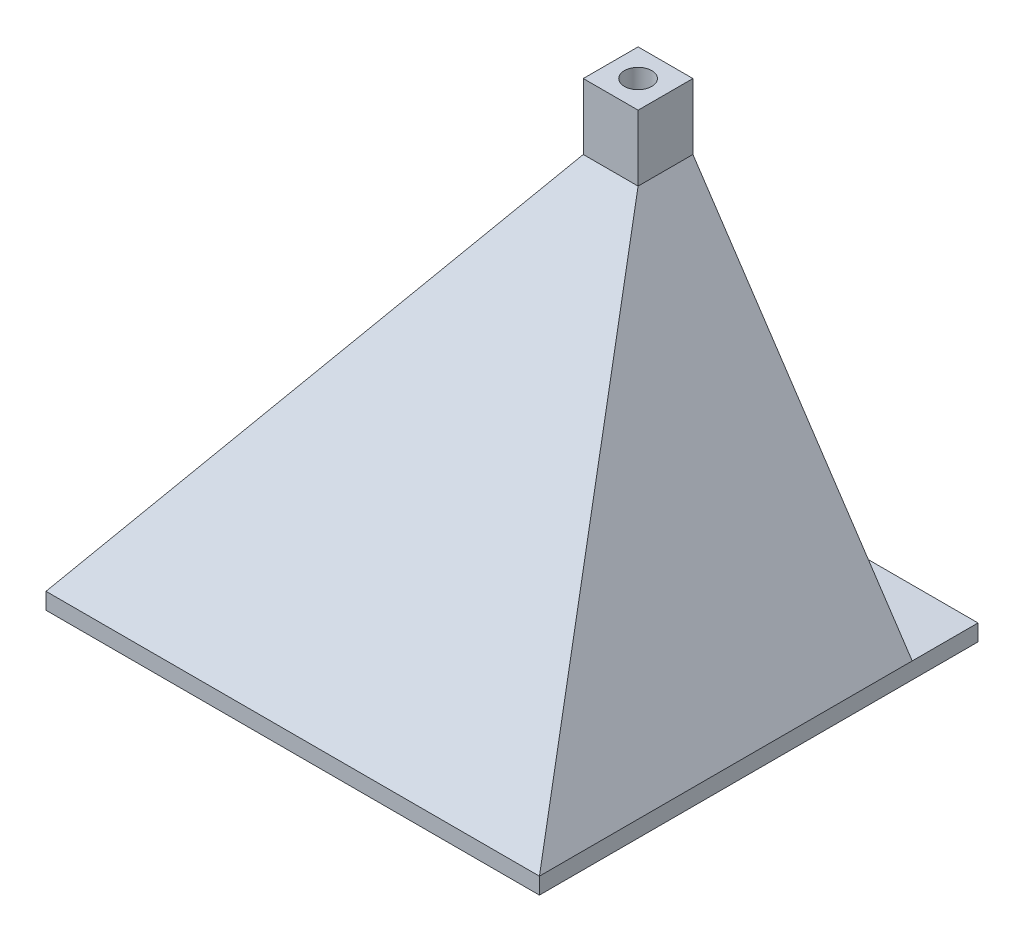
ISO-10303-21;
HEADER;
FILE_DESCRIPTION(('STEP AP214'),'2;1');
FILE_NAME('part.step','',(''),(''),'','','');
FILE_SCHEMA(('AUTOMOTIVE_DESIGN { 1 0 10303 214 1 1 1 1 }'));
ENDSEC;
DATA;
#1=APPLICATION_CONTEXT('core data for automotive mechanical design processes');
#2=APPLICATION_PROTOCOL_DEFINITION('international standard','automotive_design',2000,#1);
#3=PRODUCT_CONTEXT('',#1,'mechanical');
#4=PRODUCT('Part','Part','',(#3));
#5=PRODUCT_RELATED_PRODUCT_CATEGORY('part','',(#4));
#6=PRODUCT_DEFINITION_FORMATION('','',#4);
#7=PRODUCT_DEFINITION_CONTEXT('part definition',#1,'design');
#8=PRODUCT_DEFINITION('design','',#6,#7);
#9=PRODUCT_DEFINITION_SHAPE('','',#8);
#10=(LENGTH_UNIT() NAMED_UNIT(*) SI_UNIT(.MILLI.,.METRE.));
#11=(NAMED_UNIT(*) PLANE_ANGLE_UNIT() SI_UNIT($,.RADIAN.));
#12=(NAMED_UNIT(*) SI_UNIT($,.STERADIAN.) SOLID_ANGLE_UNIT());
#13=UNCERTAINTY_MEASURE_WITH_UNIT(LENGTH_MEASURE(1.E-05),#10,'distance_accuracy_value','');
#14=(GEOMETRIC_REPRESENTATION_CONTEXT(3) GLOBAL_UNCERTAINTY_ASSIGNED_CONTEXT((#13)) GLOBAL_UNIT_ASSIGNED_CONTEXT((#10,
#11,#12)) REPRESENTATION_CONTEXT('',''));
#15=CARTESIAN_POINT('',(0.,0.,0.));
#16=DIRECTION('',(0.,0.,1.));
#17=DIRECTION('',(1.,0.,0.));
#18=AXIS2_PLACEMENT_3D('',#15,#16,#17);
#19=CARTESIAN_POINT('',(0.,1.5,0.));
#20=DIRECTION('',(0.,-1.,0.));
#21=DIRECTION('',(0.,0.,-1.));
#22=AXIS2_PLACEMENT_3D('',#19,#20,#21);
#23=PLANE('',#22);
#24=DIRECTION('',(0.,0.,1.));
#25=VECTOR('',#24,1.);
#26=CARTESIAN_POINT('',(-22.5,1.5,20.));
#27=LINE('',#26,#25);
#28=CARTESIAN_POINT('',(-22.5,1.5,-14.));
#29=VERTEX_POINT('',#28);
#30=CARTESIAN_POINT('',(-22.5,1.5,20.));
#31=VERTEX_POINT('',#30);
#32=EDGE_CURVE('E236',#29,#31,#27,.T.);
#33=ORIENTED_EDGE('',*,*,#32,.F.);
#34=DIRECTION('',(-1.,0.,0.));
#35=VECTOR('',#34,1.);
#36=CARTESIAN_POINT('',(-22.5,1.5,-14.));
#37=LINE('',#36,#35);
#38=CARTESIAN_POINT('',(22.5,1.5,-14.));
#39=VERTEX_POINT('',#38);
#40=EDGE_CURVE('E251',#39,#29,#37,.T.);
#41=ORIENTED_EDGE('',*,*,#40,.F.);
#42=DIRECTION('',(0.,0.,-1.));
#43=VECTOR('',#42,1.);
#44=CARTESIAN_POINT('',(22.5,1.5,20.));
#45=LINE('',#44,#43);
#46=CARTESIAN_POINT('',(22.5,1.5,20.));
#47=VERTEX_POINT('',#46);
#48=EDGE_CURVE('E66',#47,#39,#45,.T.);
#49=ORIENTED_EDGE('',*,*,#48,.F.);
#50=DIRECTION('',(1.,0.,0.));
#51=VECTOR('',#50,1.);
#52=CARTESIAN_POINT('',(-22.5,1.5,20.));
#53=LINE('',#52,#51);
#54=EDGE_CURVE('E13',#31,#47,#53,.T.);
#55=ORIENTED_EDGE('',*,*,#54,.F.);
#56=EDGE_LOOP('',(#33,#41,#49,#55));
#57=FACE_BOUND('',#56,.T.);
#58=DIRECTION('',(-1.,0.,0.));
#59=VECTOR('',#58,1.);
#60=CARTESIAN_POINT('',(0.,1.5,-13.25));
#61=LINE('',#60,#59);
#62=CARTESIAN_POINT('',(21.598612181134,1.5,-13.25));
#63=VERTEX_POINT('',#62);
#64=CARTESIAN_POINT('',(-21.598612181134,1.5,-13.25));
#65=VERTEX_POINT('',#64);
#66=EDGE_CURVE('E191',#63,#65,#61,.T.);
#67=ORIENTED_EDGE('',*,*,#66,.T.);
#68=DIRECTION('',(0.,0.,1.));
#69=VECTOR('',#68,1.);
#70=CARTESIAN_POINT('',(-21.598612181134,1.5,0.));
#71=LINE('',#70,#69);
#72=CARTESIAN_POINT('',(-21.598612181134,1.5,18.9568676977487));
#73=VERTEX_POINT('',#72);
#74=EDGE_CURVE('E188',#65,#73,#71,.T.);
#75=ORIENTED_EDGE('',*,*,#74,.T.);
#76=DIRECTION('',(1.,0.,0.));
#77=VECTOR('',#76,1.);
#78=CARTESIAN_POINT('',(0.,1.5,18.9568676977487));
#79=LINE('',#78,#77);
#80=CARTESIAN_POINT('',(21.598612181134,1.5,18.9568676977487));
#81=VERTEX_POINT('',#80);
#82=EDGE_CURVE('E111',#73,#81,#79,.T.);
#83=ORIENTED_EDGE('',*,*,#82,.T.);
#84=DIRECTION('',(0.,0.,-1.));
#85=VECTOR('',#84,1.);
#86=CARTESIAN_POINT('',(21.598612181134,1.5,0.));
#87=LINE('',#86,#85);
#88=EDGE_CURVE('E74',#81,#63,#87,.T.);
#89=ORIENTED_EDGE('',*,*,#88,.T.);
#90=EDGE_LOOP('',(#67,#75,#83,#89));
#91=FACE_BOUND('',#90,.T.);
#92=ADVANCED_FACE('F55',(#57,#91),#23,.T.);
#93=CARTESIAN_POINT('',(0.,10.7188397472717,11.0884549109707));
#94=DIRECTION('',(0.,-0.695022096847475,-0.718988376049112));
#95=DIRECTION('',(0.,0.718988376049112,-0.695022096847475));
#96=AXIS2_PLACEMENT_3D('',#93,#94,#95);
#97=PLANE('',#96);
#98=DIRECTION('',(-0.432236723073677,0.648355084610515,-0.626743248456831));
#99=VECTOR('',#98,1.);
#100=CARTESIAN_POINT('',(22.5,1.5,20.));
#101=LINE('',#100,#99);
#102=CARTESIAN_POINT('',(2.5,31.5,-9.00000000000001));
#103=VERTEX_POINT('',#102);
#104=EDGE_CURVE('E83',#47,#103,#101,.T.);
#105=ORIENTED_EDGE('',*,*,#104,.T.);
#106=DIRECTION('',(1.,0.,0.));
#107=VECTOR('',#106,1.);
#108=CARTESIAN_POINT('',(-2.5,31.5,-9.00000000000001));
#109=LINE('',#108,#107);
#110=CARTESIAN_POINT('',(-2.5,31.5,-9.00000000000001));
#111=VERTEX_POINT('',#110);
#112=EDGE_CURVE('E120',#111,#103,#109,.T.);
#113=ORIENTED_EDGE('',*,*,#112,.F.);
#114=DIRECTION('',(0.432236723073677,0.648355084610515,-0.626743248456831));
#115=VECTOR('',#114,1.);
#116=CARTESIAN_POINT('',(-22.5,1.5,20.));
#117=LINE('',#116,#115);
#118=EDGE_CURVE('E125',#31,#111,#117,.T.);
#119=ORIENTED_EDGE('',*,*,#118,.F.);
#120=ORIENTED_EDGE('',*,*,#54,.T.);
#121=EDGE_LOOP('',(#105,#113,#119,#120));
#122=FACE_BOUND('',#121,.T.);
#123=ADVANCED_FACE('F118',(#122),#97,.F.);
#124=CARTESIAN_POINT('',(-16.2692307692308,10.8461538461538,0.));
#125=DIRECTION('',(0.832050294337844,-0.554700196225229,0.));
#126=DIRECTION('',(0.554700196225229,0.832050294337844,0.));
#127=AXIS2_PLACEMENT_3D('',#124,#125,#126);
#128=PLANE('',#127);
#129=ORIENTED_EDGE('',*,*,#118,.T.);
#130=DIRECTION('',(0.,0.,1.));
#131=VECTOR('',#130,1.);
#132=CARTESIAN_POINT('',(-2.5,31.5,-9.00000000000001));
#133=LINE('',#132,#131);
#134=CARTESIAN_POINT('',(-2.5,31.5,-14.));
#135=VERTEX_POINT('',#134);
#136=EDGE_CURVE('E60',#135,#111,#133,.T.);
#137=ORIENTED_EDGE('',*,*,#136,.F.);
#138=DIRECTION('',(0.554700196225229,0.832050294337844,0.));
#139=VECTOR('',#138,1.);
#140=CARTESIAN_POINT('',(-22.5,1.5,-14.));
#141=LINE('',#140,#139);
#142=EDGE_CURVE('E138',#29,#135,#141,.T.);
#143=ORIENTED_EDGE('',*,*,#142,.F.);
#144=ORIENTED_EDGE('',*,*,#32,.T.);
#145=EDGE_LOOP('',(#129,#137,#143,#144));
#146=FACE_BOUND('',#145,.T.);
#147=ADVANCED_FACE('F210',(#146),#128,.F.);
#148=CARTESIAN_POINT('',(16.2692307692308,10.8461538461539,0.));
#149=DIRECTION('',(-0.832050294337844,-0.554700196225229,0.));
#150=DIRECTION('',(0.554700196225229,-0.832050294337844,0.));
#151=AXIS2_PLACEMENT_3D('',#148,#149,#150);
#152=PLANE('',#151);
#153=DIRECTION('',(-0.554700196225229,0.832050294337843,0.));
#154=VECTOR('',#153,1.);
#155=CARTESIAN_POINT('',(22.5,1.5,-14.));
#156=LINE('',#155,#154);
#157=CARTESIAN_POINT('',(2.5,31.5,-14.));
#158=VERTEX_POINT('',#157);
#159=EDGE_CURVE('E105',#39,#158,#156,.T.);
#160=ORIENTED_EDGE('',*,*,#159,.T.);
#161=DIRECTION('',(0.,0.,-1.));
#162=VECTOR('',#161,1.);
#163=CARTESIAN_POINT('',(2.5,31.5,-9.00000000000001));
#164=LINE('',#163,#162);
#165=EDGE_CURVE('E101',#103,#158,#164,.T.);
#166=ORIENTED_EDGE('',*,*,#165,.F.);
#167=ORIENTED_EDGE('',*,*,#104,.F.);
#168=ORIENTED_EDGE('',*,*,#48,.T.);
#169=EDGE_LOOP('',(#160,#166,#167,#168));
#170=FACE_BOUND('',#169,.T.);
#171=ADVANCED_FACE('F103',(#170),#152,.F.);
#172=CARTESIAN_POINT('',(0.,0.,-14.));
#173=DIRECTION('',(0.,0.,1.));
#174=DIRECTION('',(1.,0.,0.));
#175=AXIS2_PLACEMENT_3D('',#172,#173,#174);
#176=PLANE('',#175);
#177=CARTESIAN_POINT('',(0.,14.5,-14.));
#178=DIRECTION('',(0.,0.,-1.));
#179=DIRECTION('',(-1.,0.,0.));
#180=AXIS2_PLACEMENT_3D('',#177,#178,#179);
#181=CIRCLE('',#180,1.7);
#182=CARTESIAN_POINT('',(-1.7,14.5,-14.));
#183=VERTEX_POINT('',#182);
#184=EDGE_CURVE('E430',#183,#183,#181,.T.);
#185=ORIENTED_EDGE('',*,*,#184,.F.);
#186=EDGE_LOOP('',(#185));
#187=FACE_BOUND('',#186,.T.);
#188=ORIENTED_EDGE('',*,*,#142,.T.);
#189=DIRECTION('',(0.,-1.,0.));
#190=VECTOR('',#189,1.);
#191=CARTESIAN_POINT('',(-2.5,37.5,-14.));
#192=LINE('',#191,#190);
#193=CARTESIAN_POINT('',(-2.5,37.5,-14.));
#194=VERTEX_POINT('',#193);
#195=EDGE_CURVE('E147',#194,#135,#192,.T.);
#196=ORIENTED_EDGE('',*,*,#195,.F.);
#197=DIRECTION('',(-1.,0.,0.));
#198=VECTOR('',#197,1.);
#199=CARTESIAN_POINT('',(2.5,37.5,-14.));
#200=LINE('',#199,#198);
#201=CARTESIAN_POINT('',(2.5,37.5,-14.));
#202=VERTEX_POINT('',#201);
#203=EDGE_CURVE('E406',#202,#194,#200,.T.);
#204=ORIENTED_EDGE('',*,*,#203,.F.);
#205=DIRECTION('',(0.,-1.,0.));
#206=VECTOR('',#205,1.);
#207=CARTESIAN_POINT('',(2.5,37.5,-14.));
#208=LINE('',#207,#206);
#209=EDGE_CURVE('E164',#202,#158,#208,.T.);
#210=ORIENTED_EDGE('',*,*,#209,.T.);
#211=ORIENTED_EDGE('',*,*,#159,.F.);
#212=ORIENTED_EDGE('',*,*,#40,.T.);
#213=EDGE_LOOP('',(#188,#196,#204,#210,#211,#212));
#214=FACE_BOUND('',#213,.T.);
#215=ADVANCED_FACE('F57',(#187,#214),#176,.F.);
#216=CARTESIAN_POINT('',(0.,10.1975731746361,10.5492136289339));
#217=DIRECTION('',(0.,-0.695022096847475,-0.718988376049112));
#218=DIRECTION('',(0.,0.718988376049112,-0.695022096847475));
#219=AXIS2_PLACEMENT_3D('',#216,#217,#218);
#220=PLANE('',#219);
#221=DIRECTION('',(-0.432236723073677,0.648355084610515,-0.626743248456831));
#222=VECTOR('',#221,1.);
#223=CARTESIAN_POINT('',(12.848295442625,14.6254751077636,6.26890842691062));
#224=LINE('',#223,#222);
#225=CARTESIAN_POINT('',(1.59861218113401,31.5,-10.0431323022513));
#226=VERTEX_POINT('',#225);
#227=EDGE_CURVE('E418',#81,#226,#224,.T.);
#228=ORIENTED_EDGE('',*,*,#227,.F.);
#229=ORIENTED_EDGE('',*,*,#82,.F.);
#230=DIRECTION('',(0.432236723073677,0.648355084610515,-0.626743248456831));
#231=VECTOR('',#230,1.);
#232=CARTESIAN_POINT('',(-12.848295442625,14.6254751077636,6.26890842691062));
#233=LINE('',#232,#231);
#234=CARTESIAN_POINT('',(-1.598612181134,31.5,-10.0431323022513));
#235=VERTEX_POINT('',#234);
#236=EDGE_CURVE('E192',#73,#235,#233,.T.);
#237=ORIENTED_EDGE('',*,*,#236,.T.);
#238=DIRECTION('',(1.,0.,0.));
#239=VECTOR('',#238,1.);
#240=CARTESIAN_POINT('',(0.,31.5,-10.0431323022513));
#241=LINE('',#240,#239);
#242=EDGE_CURVE('E181',#235,#226,#241,.T.);
#243=ORIENTED_EDGE('',*,*,#242,.T.);
#244=EDGE_LOOP('',(#228,#229,#237,#243));
#245=FACE_BOUND('',#244,.T.);
#246=ADVANCED_FACE('F345',(#245),#220,.T.);
#247=CARTESIAN_POINT('',(-15.6451930484774,10.4301286989849,0.));
#248=DIRECTION('',(0.832050294337844,-0.554700196225229,0.));
#249=DIRECTION('',(0.554700196225229,0.832050294337844,0.));
#250=AXIS2_PLACEMENT_3D('',#247,#248,#249);
#251=PLANE('',#250);
#252=ORIENTED_EDGE('',*,*,#236,.F.);
#253=ORIENTED_EDGE('',*,*,#74,.F.);
#254=DIRECTION('',(0.554700196225229,0.832050294337844,0.));
#255=VECTOR('',#254,1.);
#256=CARTESIAN_POINT('',(-15.6451930484774,10.4301286989849,-13.25));
#257=LINE('',#256,#255);
#258=CARTESIAN_POINT('',(-1.598612181134,31.5,-13.25));
#259=VERTEX_POINT('',#258);
#260=EDGE_CURVE('E384',#65,#259,#257,.T.);
#261=ORIENTED_EDGE('',*,*,#260,.T.);
#262=DIRECTION('',(0.,0.,1.));
#263=VECTOR('',#262,1.);
#264=CARTESIAN_POINT('',(-1.598612181134,31.5,0.));
#265=LINE('',#264,#263);
#266=EDGE_CURVE('E178',#259,#235,#265,.T.);
#267=ORIENTED_EDGE('',*,*,#266,.T.);
#268=EDGE_LOOP('',(#252,#253,#261,#267));
#269=FACE_BOUND('',#268,.T.);
#270=ADVANCED_FACE('F348',(#269),#251,.T.);
#271=CARTESIAN_POINT('',(15.6451930484774,10.4301286989849,0.));
#272=DIRECTION('',(-0.832050294337844,-0.554700196225229,0.));
#273=DIRECTION('',(0.554700196225229,-0.832050294337844,0.));
#274=AXIS2_PLACEMENT_3D('',#271,#272,#273);
#275=PLANE('',#274);
#276=DIRECTION('',(-0.554700196225229,0.832050294337844,0.));
#277=VECTOR('',#276,1.);
#278=CARTESIAN_POINT('',(15.6451930484774,10.4301286989849,-13.25));
#279=LINE('',#278,#277);
#280=CARTESIAN_POINT('',(1.59861218113401,31.5,-13.25));
#281=VERTEX_POINT('',#280);
#282=EDGE_CURVE('E382',#63,#281,#279,.T.);
#283=ORIENTED_EDGE('',*,*,#282,.F.);
#284=ORIENTED_EDGE('',*,*,#88,.F.);
#285=ORIENTED_EDGE('',*,*,#227,.T.);
#286=DIRECTION('',(0.,0.,-1.));
#287=VECTOR('',#286,1.);
#288=CARTESIAN_POINT('',(1.59861218113401,31.5,0.));
#289=LINE('',#288,#287);
#290=EDGE_CURVE('E168',#226,#281,#289,.T.);
#291=ORIENTED_EDGE('',*,*,#290,.T.);
#292=EDGE_LOOP('',(#283,#284,#285,#291));
#293=FACE_BOUND('',#292,.T.);
#294=ADVANCED_FACE('F352',(#293),#275,.T.);
#295=CARTESIAN_POINT('',(0.,0.,-13.25));
#296=DIRECTION('',(0.,0.,1.));
#297=DIRECTION('',(1.,0.,0.));
#298=AXIS2_PLACEMENT_3D('',#295,#296,#297);
#299=PLANE('',#298);
#300=CARTESIAN_POINT('',(0.,14.5,-13.25));
#301=DIRECTION('',(0.,0.,1.));
#302=DIRECTION('',(1.,0.,0.));
#303=AXIS2_PLACEMENT_3D('',#300,#301,#302);
#304=CIRCLE('',#303,1.7);
#305=CARTESIAN_POINT('',(1.7,14.5,-13.25));
#306=VERTEX_POINT('',#305);
#307=EDGE_CURVE('E432',#306,#306,#304,.F.);
#308=ORIENTED_EDGE('',*,*,#307,.T.);
#309=EDGE_LOOP('',(#308));
#310=FACE_BOUND('',#309,.T.);
#311=ORIENTED_EDGE('',*,*,#260,.F.);
#312=ORIENTED_EDGE('',*,*,#66,.F.);
#313=ORIENTED_EDGE('',*,*,#282,.T.);
#314=DIRECTION('',(-1.,0.,0.));
#315=VECTOR('',#314,1.);
#316=CARTESIAN_POINT('',(0.,31.5,-13.25));
#317=LINE('',#316,#315);
#318=EDGE_CURVE('E173',#281,#259,#317,.T.);
#319=ORIENTED_EDGE('',*,*,#318,.T.);
#320=EDGE_LOOP('',(#311,#312,#313,#319));
#321=FACE_BOUND('',#320,.T.);
#322=ADVANCED_FACE('F355',(#310,#321),#299,.T.);
#323=CARTESIAN_POINT('',(0.,37.5,0.));
#324=DIRECTION('',(0.,1.,0.));
#325=DIRECTION('',(0.,0.,1.));
#326=AXIS2_PLACEMENT_3D('',#323,#324,#325);
#327=PLANE('',#326);
#328=DIRECTION('',(0.,0.,-1.));
#329=VECTOR('',#328,1.);
#330=CARTESIAN_POINT('',(2.5,37.5,-9.00000000000001));
#331=LINE('',#330,#329);
#332=CARTESIAN_POINT('',(2.5,37.5,-9.00000000000001));
#333=VERTEX_POINT('',#332);
#334=EDGE_CURVE('E144',#333,#202,#331,.T.);
#335=ORIENTED_EDGE('',*,*,#334,.T.);
#336=ORIENTED_EDGE('',*,*,#203,.T.);
#337=DIRECTION('',(0.,0.,1.));
#338=VECTOR('',#337,1.);
#339=CARTESIAN_POINT('',(-2.5,37.5,-14.));
#340=LINE('',#339,#338);
#341=CARTESIAN_POINT('',(-2.5,37.5,-9.00000000000001));
#342=VERTEX_POINT('',#341);
#343=EDGE_CURVE('E150',#194,#342,#340,.T.);
#344=ORIENTED_EDGE('',*,*,#343,.T.);
#345=DIRECTION('',(1.,0.,0.));
#346=VECTOR('',#345,1.);
#347=CARTESIAN_POINT('',(-2.5,37.5,-9.00000000000001));
#348=LINE('',#347,#346);
#349=EDGE_CURVE('E145',#342,#333,#348,.T.);
#350=ORIENTED_EDGE('',*,*,#349,.T.);
#351=EDGE_LOOP('',(#335,#336,#344,#350));
#352=FACE_BOUND('',#351,.T.);
#353=CARTESIAN_POINT('',(0.,37.5,-11.5));
#354=DIRECTION('',(0.,1.,0.));
#355=DIRECTION('',(0.,0.,1.));
#356=AXIS2_PLACEMENT_3D('',#353,#354,#355);
#357=CIRCLE('',#356,1.25);
#358=CARTESIAN_POINT('',(0.,37.5,-10.25));
#359=VERTEX_POINT('',#358);
#360=EDGE_CURVE('E410',#359,#359,#357,.T.);
#361=ORIENTED_EDGE('',*,*,#360,.F.);
#362=EDGE_LOOP('',(#361));
#363=FACE_BOUND('',#362,.T.);
#364=ADVANCED_FACE('F357',(#352,#363),#327,.T.);
#365=CARTESIAN_POINT('',(0.,31.5,0.));
#366=DIRECTION('',(0.,1.,0.));
#367=DIRECTION('',(0.,0.,1.));
#368=AXIS2_PLACEMENT_3D('',#365,#366,#367);
#369=PLANE('',#368);
#370=ORIENTED_EDGE('',*,*,#242,.F.);
#371=ORIENTED_EDGE('',*,*,#266,.F.);
#372=ORIENTED_EDGE('',*,*,#318,.F.);
#373=ORIENTED_EDGE('',*,*,#290,.F.);
#374=EDGE_LOOP('',(#370,#371,#372,#373));
#375=FACE_BOUND('',#374,.T.);
#376=CARTESIAN_POINT('',(0.,31.5,-11.5));
#377=DIRECTION('',(0.,1.,0.));
#378=DIRECTION('',(0.,0.,1.));
#379=AXIS2_PLACEMENT_3D('',#376,#377,#378);
#380=CIRCLE('',#379,1.25);
#381=CARTESIAN_POINT('',(0.,31.5,-10.25));
#382=VERTEX_POINT('',#381);
#383=EDGE_CURVE('E413',#382,#382,#380,.T.);
#384=ORIENTED_EDGE('',*,*,#383,.T.);
#385=EDGE_LOOP('',(#384));
#386=FACE_BOUND('',#385,.T.);
#387=ADVANCED_FACE('F344',(#375,#386),#369,.F.);
#388=CARTESIAN_POINT('',(2.5,37.5,-9.00000000000001));
#389=DIRECTION('',(-1.,0.,0.));
#390=DIRECTION('',(0.,0.,1.));
#391=AXIS2_PLACEMENT_3D('',#388,#389,#390);
#392=PLANE('',#391);
#393=ORIENTED_EDGE('',*,*,#165,.T.);
#394=ORIENTED_EDGE('',*,*,#209,.F.);
#395=ORIENTED_EDGE('',*,*,#334,.F.);
#396=DIRECTION('',(0.,-1.,0.));
#397=VECTOR('',#396,1.);
#398=CARTESIAN_POINT('',(2.5,37.5,-9.00000000000001));
#399=LINE('',#398,#397);
#400=EDGE_CURVE('E134',#333,#103,#399,.T.);
#401=ORIENTED_EDGE('',*,*,#400,.T.);
#402=EDGE_LOOP('',(#393,#394,#395,#401));
#403=FACE_BOUND('',#402,.T.);
#404=ADVANCED_FACE('F142',(#403),#392,.F.);
#405=CARTESIAN_POINT('',(-2.5,37.5,-14.));
#406=DIRECTION('',(1.,0.,0.));
#407=DIRECTION('',(0.,0.,-1.));
#408=AXIS2_PLACEMENT_3D('',#405,#406,#407);
#409=PLANE('',#408);
#410=ORIENTED_EDGE('',*,*,#136,.T.);
#411=DIRECTION('',(0.,-1.,0.));
#412=VECTOR('',#411,1.);
#413=CARTESIAN_POINT('',(-2.5,37.5,-9.00000000000001));
#414=LINE('',#413,#412);
#415=EDGE_CURVE('E137',#342,#111,#414,.T.);
#416=ORIENTED_EDGE('',*,*,#415,.F.);
#417=ORIENTED_EDGE('',*,*,#343,.F.);
#418=ORIENTED_EDGE('',*,*,#195,.T.);
#419=EDGE_LOOP('',(#410,#416,#417,#418));
#420=FACE_BOUND('',#419,.T.);
#421=ADVANCED_FACE('F331',(#420),#409,.F.);
#422=CARTESIAN_POINT('',(-2.5,37.5,-9.00000000000001));
#423=DIRECTION('',(0.,0.,-1.));
#424=DIRECTION('',(-1.,0.,0.));
#425=AXIS2_PLACEMENT_3D('',#422,#423,#424);
#426=PLANE('',#425);
#427=ORIENTED_EDGE('',*,*,#112,.T.);
#428=ORIENTED_EDGE('',*,*,#400,.F.);
#429=ORIENTED_EDGE('',*,*,#349,.F.);
#430=ORIENTED_EDGE('',*,*,#415,.T.);
#431=EDGE_LOOP('',(#427,#428,#429,#430));
#432=FACE_BOUND('',#431,.T.);
#433=ADVANCED_FACE('F131',(#432),#426,.F.);
#434=CARTESIAN_POINT('',(0.,37.5,-11.5));
#435=DIRECTION('',(0.,-1.,0.));
#436=DIRECTION('',(0.,0.,-1.));
#437=AXIS2_PLACEMENT_3D('',#434,#435,#436);
#438=CYLINDRICAL_SURFACE('',#437,1.25);
#439=ORIENTED_EDGE('',*,*,#360,.T.);
#440=EDGE_LOOP('',(#439));
#441=FACE_BOUND('',#440,.T.);
#442=ORIENTED_EDGE('',*,*,#383,.F.);
#443=EDGE_LOOP('',(#442));
#444=FACE_BOUND('',#443,.T.);
#445=ADVANCED_FACE('F441',(#441,#444),#438,.F.);
#446=CARTESIAN_POINT('',(0.,14.5,20.0011));
#447=DIRECTION('',(0.,0.,-1.));
#448=DIRECTION('',(-1.,0.,0.));
#449=AXIS2_PLACEMENT_3D('',#446,#447,#448);
#450=CYLINDRICAL_SURFACE('',#449,1.7);
#451=ORIENTED_EDGE('',*,*,#307,.F.);
#452=EDGE_LOOP('',(#451));
#453=FACE_BOUND('',#452,.T.);
#454=ORIENTED_EDGE('',*,*,#184,.T.);
#455=EDGE_LOOP('',(#454));
#456=FACE_BOUND('',#455,.T.);
#457=ADVANCED_FACE('F439',(#453,#456),#450,.F.);
#458=CLOSED_SHELL('',(#92,#123,#147,#171,#215,#246,#270,#294,#322,#364,#387,#404,#421,#433,#445,#457));
#459=MANIFOLD_SOLID_BREP('B2',#458);
#460=CARTESIAN_POINT('',(0.,1.5,0.));
#461=DIRECTION('',(0.,1.,0.));
#462=DIRECTION('',(0.,0.,1.));
#463=AXIS2_PLACEMENT_3D('',#460,#461,#462);
#464=PLANE('',#463);
#465=DIRECTION('',(1.,0.,0.));
#466=VECTOR('',#465,1.);
#467=CARTESIAN_POINT('',(-21.5,1.5,19.));
#468=LINE('',#467,#466);
#469=CARTESIAN_POINT('',(-21.5,1.5,19.));
#470=VERTEX_POINT('',#469);
#471=CARTESIAN_POINT('',(21.5,1.5,19.));
#472=VERTEX_POINT('',#471);
#473=EDGE_CURVE('E702',#470,#472,#468,.T.);
#474=ORIENTED_EDGE('',*,*,#473,.F.);
#475=DIRECTION('',(0.,0.,1.));
#476=VECTOR('',#475,1.);
#477=CARTESIAN_POINT('',(-21.5,1.5,19.));
#478=LINE('',#477,#476);
#479=CARTESIAN_POINT('',(-21.5,1.5,-13.));
#480=VERTEX_POINT('',#479);
#481=EDGE_CURVE('E700',#480,#470,#478,.T.);
#482=ORIENTED_EDGE('',*,*,#481,.F.);
#483=DIRECTION('',(-1.,0.,0.));
#484=VECTOR('',#483,1.);
#485=CARTESIAN_POINT('',(-21.5,1.5,-13.));
#486=LINE('',#485,#484);
#487=CARTESIAN_POINT('',(21.5,1.5,-13.));
#488=VERTEX_POINT('',#487);
#489=EDGE_CURVE('E708',#488,#480,#486,.T.);
#490=ORIENTED_EDGE('',*,*,#489,.F.);
#491=DIRECTION('',(0.,0.,-1.));
#492=VECTOR('',#491,1.);
#493=CARTESIAN_POINT('',(21.5,1.5,19.));
#494=LINE('',#493,#492);
#495=EDGE_CURVE('E705',#472,#488,#494,.T.);
#496=ORIENTED_EDGE('',*,*,#495,.F.);
#497=EDGE_LOOP('',(#474,#482,#490,#496));
#498=FACE_BOUND('',#497,.T.);
#499=DIRECTION('',(0.,0.,1.));
#500=VECTOR('',#499,1.);
#501=CARTESIAN_POINT('',(-22.5,1.5,-20.));
#502=LINE('',#501,#500);
#503=CARTESIAN_POINT('',(-22.5,1.5,-20.));
#504=VERTEX_POINT('',#503);
#505=CARTESIAN_POINT('',(-22.5,1.5,20.));
#506=VERTEX_POINT('',#505);
#507=EDGE_CURVE('E731',#504,#506,#502,.T.);
#508=ORIENTED_EDGE('',*,*,#507,.T.);
#509=DIRECTION('',(1.,0.,0.));
#510=VECTOR('',#509,1.);
#511=CARTESIAN_POINT('',(-22.5,1.5,20.));
#512=LINE('',#511,#510);
#513=CARTESIAN_POINT('',(22.5,1.5,20.));
#514=VERTEX_POINT('',#513);
#515=EDGE_CURVE('E734',#506,#514,#512,.T.);
#516=ORIENTED_EDGE('',*,*,#515,.T.);
#517=DIRECTION('',(0.,0.,-1.));
#518=VECTOR('',#517,1.);
#519=CARTESIAN_POINT('',(22.5,1.5,-20.));
#520=LINE('',#519,#518);
#521=CARTESIAN_POINT('',(22.5,1.5,-20.));
#522=VERTEX_POINT('',#521);
#523=EDGE_CURVE('E737',#514,#522,#520,.T.);
#524=ORIENTED_EDGE('',*,*,#523,.T.);
#525=DIRECTION('',(-1.,0.,0.));
#526=VECTOR('',#525,1.);
#527=CARTESIAN_POINT('',(-22.5,1.5,-20.));
#528=LINE('',#527,#526);
#529=EDGE_CURVE('E739',#522,#504,#528,.T.);
#530=ORIENTED_EDGE('',*,*,#529,.T.);
#531=EDGE_LOOP('',(#508,#516,#524,#530));
#532=FACE_BOUND('',#531,.T.);
#533=DIRECTION('',(1.,0.,0.));
#534=VECTOR('',#533,1.);
#535=CARTESIAN_POINT('',(-12.5,1.5,-15.3));
#536=LINE('',#535,#534);
#537=CARTESIAN_POINT('',(-12.5,1.5,-15.3));
#538=VERTEX_POINT('',#537);
#539=CARTESIAN_POINT('',(12.5,1.5,-15.3));
#540=VERTEX_POINT('',#539);
#541=EDGE_CURVE('E672',#538,#540,#536,.T.);
#542=ORIENTED_EDGE('',*,*,#541,.F.);
#543=CARTESIAN_POINT('',(-12.5,1.5,-17.));
#544=DIRECTION('',(0.,1.,0.));
#545=DIRECTION('',(0.,0.,1.));
#546=AXIS2_PLACEMENT_3D('',#543,#544,#545);
#547=CIRCLE('',#546,1.7);
#548=CARTESIAN_POINT('',(-12.5,1.5,-18.7));
#549=VERTEX_POINT('',#548);
#550=EDGE_CURVE('E664',#549,#538,#547,.T.);
#551=ORIENTED_EDGE('',*,*,#550,.F.);
#552=DIRECTION('',(-1.,0.,0.));
#553=VECTOR('',#552,1.);
#554=CARTESIAN_POINT('',(-12.5,1.5,-18.7));
#555=LINE('',#554,#553);
#556=CARTESIAN_POINT('',(12.5,1.5,-18.7));
#557=VERTEX_POINT('',#556);
#558=EDGE_CURVE('E686',#557,#549,#555,.T.);
#559=ORIENTED_EDGE('',*,*,#558,.F.);
#560=CARTESIAN_POINT('',(12.5,1.5,-17.));
#561=DIRECTION('',(0.,1.,0.));
#562=DIRECTION('',(0.,0.,1.));
#563=AXIS2_PLACEMENT_3D('',#560,#561,#562);
#564=CIRCLE('',#563,1.7);
#565=EDGE_CURVE('E684',#540,#557,#564,.T.);
#566=ORIENTED_EDGE('',*,*,#565,.F.);
#567=EDGE_LOOP('',(#542,#551,#559,#566));
#568=FACE_BOUND('',#567,.T.);
#569=ADVANCED_FACE('F575',(#498,#532,#568),#464,.T.);
#570=CARTESIAN_POINT('',(0.,0.,0.));
#571=DIRECTION('',(0.,1.,0.));
#572=DIRECTION('',(0.,0.,1.));
#573=AXIS2_PLACEMENT_3D('',#570,#571,#572);
#574=PLANE('',#573);
#575=DIRECTION('',(0.,0.,1.));
#576=VECTOR('',#575,1.);
#577=CARTESIAN_POINT('',(-21.5,0.,19.));
#578=LINE('',#577,#576);
#579=CARTESIAN_POINT('',(-21.5,0.,-13.));
#580=VERTEX_POINT('',#579);
#581=CARTESIAN_POINT('',(-21.5,0.,19.));
#582=VERTEX_POINT('',#581);
#583=EDGE_CURVE('E680',#580,#582,#578,.T.);
#584=ORIENTED_EDGE('',*,*,#583,.T.);
#585=DIRECTION('',(1.,0.,0.));
#586=VECTOR('',#585,1.);
#587=CARTESIAN_POINT('',(-21.5,0.,19.));
#588=LINE('',#587,#586);
#589=CARTESIAN_POINT('',(21.5,0.,19.));
#590=VERTEX_POINT('',#589);
#591=EDGE_CURVE('E713',#582,#590,#588,.T.);
#592=ORIENTED_EDGE('',*,*,#591,.T.);
#593=DIRECTION('',(0.,0.,-1.));
#594=VECTOR('',#593,1.);
#595=CARTESIAN_POINT('',(21.5,0.,19.));
#596=LINE('',#595,#594);
#597=CARTESIAN_POINT('',(21.5,0.,-13.));
#598=VERTEX_POINT('',#597);
#599=EDGE_CURVE('E716',#590,#598,#596,.T.);
#600=ORIENTED_EDGE('',*,*,#599,.T.);
#601=DIRECTION('',(-1.,0.,0.));
#602=VECTOR('',#601,1.);
#603=CARTESIAN_POINT('',(-21.5,0.,-13.));
#604=LINE('',#603,#602);
#605=EDGE_CURVE('E703',#598,#580,#604,.T.);
#606=ORIENTED_EDGE('',*,*,#605,.T.);
#607=EDGE_LOOP('',(#584,#592,#600,#606));
#608=FACE_BOUND('',#607,.T.);
#609=DIRECTION('',(0.,0.,1.));
#610=VECTOR('',#609,1.);
#611=CARTESIAN_POINT('',(-22.5,0.,-20.));
#612=LINE('',#611,#610);
#613=CARTESIAN_POINT('',(-22.5,0.,-20.));
#614=VERTEX_POINT('',#613);
#615=CARTESIAN_POINT('',(-22.5,0.,20.));
#616=VERTEX_POINT('',#615);
#617=EDGE_CURVE('E730',#614,#616,#612,.T.);
#618=ORIENTED_EDGE('',*,*,#617,.F.);
#619=DIRECTION('',(-1.,0.,0.));
#620=VECTOR('',#619,1.);
#621=CARTESIAN_POINT('',(-22.5,0.,-20.));
#622=LINE('',#621,#620);
#623=CARTESIAN_POINT('',(22.5,0.,-20.));
#624=VERTEX_POINT('',#623);
#625=EDGE_CURVE('E735',#624,#614,#622,.T.);
#626=ORIENTED_EDGE('',*,*,#625,.F.);
#627=DIRECTION('',(0.,0.,-1.));
#628=VECTOR('',#627,1.);
#629=CARTESIAN_POINT('',(22.5,0.,-20.));
#630=LINE('',#629,#628);
#631=CARTESIAN_POINT('',(22.5,0.,20.));
#632=VERTEX_POINT('',#631);
#633=EDGE_CURVE('E746',#632,#624,#630,.T.);
#634=ORIENTED_EDGE('',*,*,#633,.F.);
#635=DIRECTION('',(1.,0.,0.));
#636=VECTOR('',#635,1.);
#637=CARTESIAN_POINT('',(-22.5,0.,20.));
#638=LINE('',#637,#636);
#639=EDGE_CURVE('E744',#616,#632,#638,.T.);
#640=ORIENTED_EDGE('',*,*,#639,.F.);
#641=EDGE_LOOP('',(#618,#626,#634,#640));
#642=FACE_BOUND('',#641,.T.);
#643=CARTESIAN_POINT('',(-12.5,0.,-17.));
#644=DIRECTION('',(0.,1.,0.));
#645=DIRECTION('',(0.,0.,1.));
#646=AXIS2_PLACEMENT_3D('',#643,#644,#645);
#647=CIRCLE('',#646,1.7);
#648=CARTESIAN_POINT('',(-12.5,0.,-18.7));
#649=VERTEX_POINT('',#648);
#650=CARTESIAN_POINT('',(-12.5,0.,-15.3));
#651=VERTEX_POINT('',#650);
#652=EDGE_CURVE('E598',#649,#651,#647,.T.);
#653=ORIENTED_EDGE('',*,*,#652,.T.);
#654=DIRECTION('',(1.,0.,0.));
#655=VECTOR('',#654,1.);
#656=CARTESIAN_POINT('',(-12.5,0.,-15.3));
#657=LINE('',#656,#655);
#658=CARTESIAN_POINT('',(12.5,0.,-15.3));
#659=VERTEX_POINT('',#658);
#660=EDGE_CURVE('E679',#651,#659,#657,.T.);
#661=ORIENTED_EDGE('',*,*,#660,.T.);
#662=CARTESIAN_POINT('',(12.5,0.,-17.));
#663=DIRECTION('',(0.,1.,0.));
#664=DIRECTION('',(0.,0.,1.));
#665=AXIS2_PLACEMENT_3D('',#662,#663,#664);
#666=CIRCLE('',#665,1.7);
#667=CARTESIAN_POINT('',(12.5,0.,-18.7));
#668=VERTEX_POINT('',#667);
#669=EDGE_CURVE('E692',#659,#668,#666,.T.);
#670=ORIENTED_EDGE('',*,*,#669,.T.);
#671=DIRECTION('',(-1.,0.,0.));
#672=VECTOR('',#671,1.);
#673=CARTESIAN_POINT('',(-12.5,0.,-18.7));
#674=LINE('',#673,#672);
#675=EDGE_CURVE('E673',#668,#649,#674,.T.);
#676=ORIENTED_EDGE('',*,*,#675,.T.);
#677=EDGE_LOOP('',(#653,#661,#670,#676));
#678=FACE_BOUND('',#677,.T.);
#679=ADVANCED_FACE('F764',(#608,#642,#678),#574,.F.);
#680=CARTESIAN_POINT('',(-22.5,1.5,-20.));
#681=DIRECTION('',(1.,0.,0.));
#682=DIRECTION('',(0.,0.,-1.));
#683=AXIS2_PLACEMENT_3D('',#680,#681,#682);
#684=PLANE('',#683);
#685=ORIENTED_EDGE('',*,*,#617,.T.);
#686=DIRECTION('',(0.,-1.,0.));
#687=VECTOR('',#686,1.);
#688=CARTESIAN_POINT('',(-22.5,1.5,20.));
#689=LINE('',#688,#687);
#690=EDGE_CURVE('E53',#506,#616,#689,.T.);
#691=ORIENTED_EDGE('',*,*,#690,.F.);
#692=ORIENTED_EDGE('',*,*,#507,.F.);
#693=DIRECTION('',(0.,-1.,0.));
#694=VECTOR('',#693,1.);
#695=CARTESIAN_POINT('',(-22.5,1.5,-20.));
#696=LINE('',#695,#694);
#697=EDGE_CURVE('E741',#504,#614,#696,.T.);
#698=ORIENTED_EDGE('',*,*,#697,.T.);
#699=EDGE_LOOP('',(#685,#691,#692,#698));
#700=FACE_BOUND('',#699,.T.);
#701=ADVANCED_FACE('F577',(#700),#684,.F.);
#702=CARTESIAN_POINT('',(-22.5,1.5,20.));
#703=DIRECTION('',(0.,0.,-1.));
#704=DIRECTION('',(-1.,0.,0.));
#705=AXIS2_PLACEMENT_3D('',#702,#703,#704);
#706=PLANE('',#705);
#707=ORIENTED_EDGE('',*,*,#639,.T.);
#708=DIRECTION('',(0.,-1.,0.));
#709=VECTOR('',#708,1.);
#710=CARTESIAN_POINT('',(22.5,1.5,20.));
#711=LINE('',#710,#709);
#712=EDGE_CURVE('E583',#514,#632,#711,.T.);
#713=ORIENTED_EDGE('',*,*,#712,.F.);
#714=ORIENTED_EDGE('',*,*,#515,.F.);
#715=ORIENTED_EDGE('',*,*,#690,.T.);
#716=EDGE_LOOP('',(#707,#713,#714,#715));
#717=FACE_BOUND('',#716,.T.);
#718=ADVANCED_FACE('F774',(#717),#706,.F.);
#719=CARTESIAN_POINT('',(22.5,1.5,-20.));
#720=DIRECTION('',(-1.,0.,0.));
#721=DIRECTION('',(0.,0.,1.));
#722=AXIS2_PLACEMENT_3D('',#719,#720,#721);
#723=PLANE('',#722);
#724=ORIENTED_EDGE('',*,*,#633,.T.);
#725=DIRECTION('',(0.,-1.,0.));
#726=VECTOR('',#725,1.);
#727=CARTESIAN_POINT('',(22.5,1.5,-20.));
#728=LINE('',#727,#726);
#729=EDGE_CURVE('E751',#522,#624,#728,.T.);
#730=ORIENTED_EDGE('',*,*,#729,.F.);
#731=ORIENTED_EDGE('',*,*,#523,.F.);
#732=ORIENTED_EDGE('',*,*,#712,.T.);
#733=EDGE_LOOP('',(#724,#730,#731,#732));
#734=FACE_BOUND('',#733,.T.);
#735=ADVANCED_FACE('F758',(#734),#723,.F.);
#736=CARTESIAN_POINT('',(-22.5,1.5,-20.));
#737=DIRECTION('',(0.,0.,1.));
#738=DIRECTION('',(1.,0.,0.));
#739=AXIS2_PLACEMENT_3D('',#736,#737,#738);
#740=PLANE('',#739);
#741=ORIENTED_EDGE('',*,*,#625,.T.);
#742=ORIENTED_EDGE('',*,*,#697,.F.);
#743=ORIENTED_EDGE('',*,*,#529,.F.);
#744=ORIENTED_EDGE('',*,*,#729,.T.);
#745=EDGE_LOOP('',(#741,#742,#743,#744));
#746=FACE_BOUND('',#745,.T.);
#747=ADVANCED_FACE('F768',(#746),#740,.F.);
#748=CARTESIAN_POINT('',(-21.5,1.5,19.));
#749=DIRECTION('',(1.,0.,0.));
#750=DIRECTION('',(0.,0.,-1.));
#751=AXIS2_PLACEMENT_3D('',#748,#749,#750);
#752=PLANE('',#751);
#753=ORIENTED_EDGE('',*,*,#583,.F.);
#754=DIRECTION('',(0.,-1.,0.));
#755=VECTOR('',#754,1.);
#756=CARTESIAN_POINT('',(-21.5,1.5,-13.));
#757=LINE('',#756,#755);
#758=EDGE_CURVE('E710',#480,#580,#757,.T.);
#759=ORIENTED_EDGE('',*,*,#758,.F.);
#760=ORIENTED_EDGE('',*,*,#481,.T.);
#761=DIRECTION('',(0.,-1.,0.));
#762=VECTOR('',#761,1.);
#763=CARTESIAN_POINT('',(-21.5,1.5,19.));
#764=LINE('',#763,#762);
#765=EDGE_CURVE('E727',#470,#582,#764,.T.);
#766=ORIENTED_EDGE('',*,*,#765,.T.);
#767=EDGE_LOOP('',(#753,#759,#760,#766));
#768=FACE_BOUND('',#767,.T.);
#769=ADVANCED_FACE('F791',(#768),#752,.T.);
#770=CARTESIAN_POINT('',(-21.5,1.5,19.));
#771=DIRECTION('',(0.,0.,-1.));
#772=DIRECTION('',(-1.,0.,0.));
#773=AXIS2_PLACEMENT_3D('',#770,#771,#772);
#774=PLANE('',#773);
#775=ORIENTED_EDGE('',*,*,#591,.F.);
#776=ORIENTED_EDGE('',*,*,#765,.F.);
#777=ORIENTED_EDGE('',*,*,#473,.T.);
#778=DIRECTION('',(0.,-1.,0.));
#779=VECTOR('',#778,1.);
#780=CARTESIAN_POINT('',(21.5,1.5,19.));
#781=LINE('',#780,#779);
#782=EDGE_CURVE('E725',#472,#590,#781,.T.);
#783=ORIENTED_EDGE('',*,*,#782,.T.);
#784=EDGE_LOOP('',(#775,#776,#777,#783));
#785=FACE_BOUND('',#784,.T.);
#786=ADVANCED_FACE('F798',(#785),#774,.T.);
#787=CARTESIAN_POINT('',(21.5,1.5,19.));
#788=DIRECTION('',(-1.,0.,0.));
#789=DIRECTION('',(0.,0.,1.));
#790=AXIS2_PLACEMENT_3D('',#787,#788,#789);
#791=PLANE('',#790);
#792=ORIENTED_EDGE('',*,*,#599,.F.);
#793=ORIENTED_EDGE('',*,*,#782,.F.);
#794=ORIENTED_EDGE('',*,*,#495,.T.);
#795=DIRECTION('',(0.,-1.,0.));
#796=VECTOR('',#795,1.);
#797=CARTESIAN_POINT('',(21.5,1.5,-13.));
#798=LINE('',#797,#796);
#799=EDGE_CURVE('E723',#488,#598,#798,.T.);
#800=ORIENTED_EDGE('',*,*,#799,.T.);
#801=EDGE_LOOP('',(#792,#793,#794,#800));
#802=FACE_BOUND('',#801,.T.);
#803=ADVANCED_FACE('F803',(#802),#791,.T.);
#804=CARTESIAN_POINT('',(-21.5,1.5,-13.));
#805=DIRECTION('',(0.,0.,1.));
#806=DIRECTION('',(1.,0.,0.));
#807=AXIS2_PLACEMENT_3D('',#804,#805,#806);
#808=PLANE('',#807);
#809=ORIENTED_EDGE('',*,*,#605,.F.);
#810=ORIENTED_EDGE('',*,*,#799,.F.);
#811=ORIENTED_EDGE('',*,*,#489,.T.);
#812=ORIENTED_EDGE('',*,*,#758,.T.);
#813=EDGE_LOOP('',(#809,#810,#811,#812));
#814=FACE_BOUND('',#813,.T.);
#815=ADVANCED_FACE('F810',(#814),#808,.T.);
#816=CARTESIAN_POINT('',(-12.5,1.5,-17.));
#817=DIRECTION('',(0.,-1.,0.));
#818=DIRECTION('',(0.,0.,-1.));
#819=AXIS2_PLACEMENT_3D('',#816,#817,#818);
#820=CYLINDRICAL_SURFACE('',#819,1.7);
#821=ORIENTED_EDGE('',*,*,#652,.F.);
#822=DIRECTION('',(0.,-1.,0.));
#823=VECTOR('',#822,1.);
#824=CARTESIAN_POINT('',(-12.5,1.5,-18.7));
#825=LINE('',#824,#823);
#826=EDGE_CURVE('E668',#549,#649,#825,.T.);
#827=ORIENTED_EDGE('',*,*,#826,.F.);
#828=ORIENTED_EDGE('',*,*,#550,.T.);
#829=DIRECTION('',(0.,-1.,0.));
#830=VECTOR('',#829,1.);
#831=CARTESIAN_POINT('',(-12.5,1.5,-15.3));
#832=LINE('',#831,#830);
#833=EDGE_CURVE('E667',#538,#651,#832,.T.);
#834=ORIENTED_EDGE('',*,*,#833,.T.);
#835=EDGE_LOOP('',(#821,#827,#828,#834));
#836=FACE_BOUND('',#835,.T.);
#837=ADVANCED_FACE('F666',(#836),#820,.F.);
#838=CARTESIAN_POINT('',(-12.5,1.5,-15.3));
#839=DIRECTION('',(0.,0.,-1.));
#840=DIRECTION('',(-1.,0.,0.));
#841=AXIS2_PLACEMENT_3D('',#838,#839,#840);
#842=PLANE('',#841);
#843=ORIENTED_EDGE('',*,*,#660,.F.);
#844=ORIENTED_EDGE('',*,*,#833,.F.);
#845=ORIENTED_EDGE('',*,*,#541,.T.);
#846=DIRECTION('',(0.,-1.,0.));
#847=VECTOR('',#846,1.);
#848=CARTESIAN_POINT('',(12.5,1.5,-15.3));
#849=LINE('',#848,#847);
#850=EDGE_CURVE('E681',#540,#659,#849,.T.);
#851=ORIENTED_EDGE('',*,*,#850,.T.);
#852=EDGE_LOOP('',(#843,#844,#845,#851));
#853=FACE_BOUND('',#852,.T.);
#854=ADVANCED_FACE('F676',(#853),#842,.T.);
#855=CARTESIAN_POINT('',(12.5,1.5,-17.));
#856=DIRECTION('',(0.,-1.,0.));
#857=DIRECTION('',(0.,0.,-1.));
#858=AXIS2_PLACEMENT_3D('',#855,#856,#857);
#859=CYLINDRICAL_SURFACE('',#858,1.7);
#860=ORIENTED_EDGE('',*,*,#669,.F.);
#861=ORIENTED_EDGE('',*,*,#850,.F.);
#862=ORIENTED_EDGE('',*,*,#565,.T.);
#863=DIRECTION('',(0.,-1.,0.));
#864=VECTOR('',#863,1.);
#865=CARTESIAN_POINT('',(12.5,1.5,-18.7));
#866=LINE('',#865,#864);
#867=EDGE_CURVE('E590',#557,#668,#866,.T.);
#868=ORIENTED_EDGE('',*,*,#867,.T.);
#869=EDGE_LOOP('',(#860,#861,#862,#868));
#870=FACE_BOUND('',#869,.T.);
#871=ADVANCED_FACE('F827',(#870),#859,.F.);
#872=CARTESIAN_POINT('',(-12.5,1.5,-18.7));
#873=DIRECTION('',(0.,0.,1.));
#874=DIRECTION('',(1.,0.,0.));
#875=AXIS2_PLACEMENT_3D('',#872,#873,#874);
#876=PLANE('',#875);
#877=ORIENTED_EDGE('',*,*,#675,.F.);
#878=ORIENTED_EDGE('',*,*,#867,.F.);
#879=ORIENTED_EDGE('',*,*,#558,.T.);
#880=ORIENTED_EDGE('',*,*,#826,.T.);
#881=EDGE_LOOP('',(#877,#878,#879,#880));
#882=FACE_BOUND('',#881,.T.);
#883=ADVANCED_FACE('F830',(#882),#876,.T.);
#884=CLOSED_SHELL('',(#569,#679,#701,#718,#735,#747,#769,#786,#803,#815,#837,#854,#871,#883));
#885=MANIFOLD_SOLID_BREP('B7',#884);
#886=ADVANCED_BREP_SHAPE_REPRESENTATION('',(#18,#459,#885),#14);
#887=SHAPE_DEFINITION_REPRESENTATION(#9,#886);
ENDSEC;
END-ISO-10303-21;
